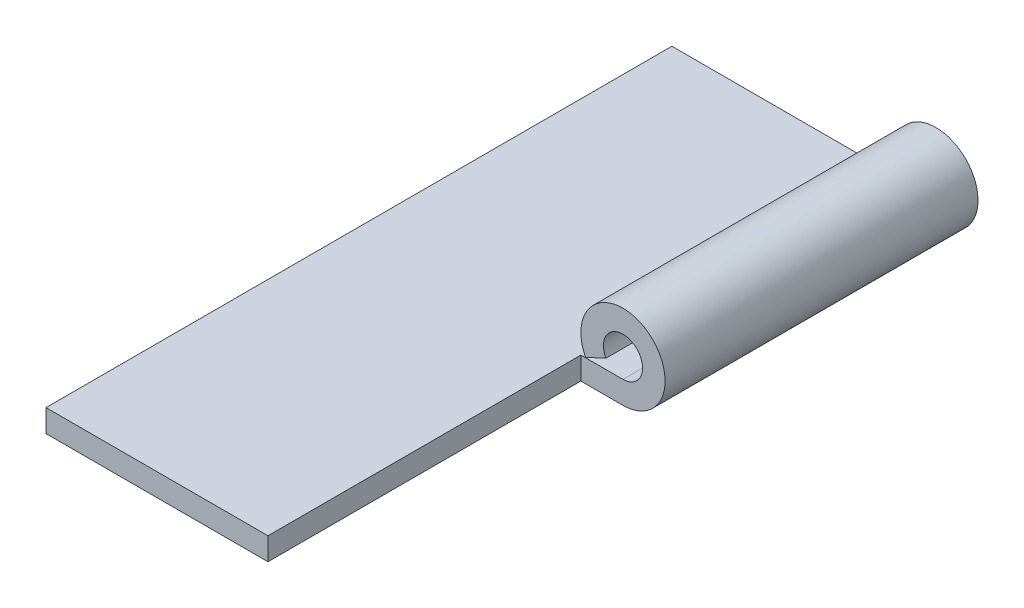
ISO-10303-21;
HEADER;
FILE_DESCRIPTION(('STEP AP214'),'2;1');
FILE_NAME('part.step','',(''),(''),'','','');
FILE_SCHEMA(('AUTOMOTIVE_DESIGN { 1 0 10303 214 1 1 1 1 }'));
ENDSEC;
DATA;
#1=APPLICATION_CONTEXT('core data for automotive mechanical design processes');
#2=APPLICATION_PROTOCOL_DEFINITION('international standard','automotive_design',2000,#1);
#3=PRODUCT_CONTEXT('',#1,'mechanical');
#4=PRODUCT('Part','Part','',(#3));
#5=PRODUCT_RELATED_PRODUCT_CATEGORY('part','',(#4));
#6=PRODUCT_DEFINITION_FORMATION('','',#4);
#7=PRODUCT_DEFINITION_CONTEXT('part definition',#1,'design');
#8=PRODUCT_DEFINITION('design','',#6,#7);
#9=PRODUCT_DEFINITION_SHAPE('','',#8);
#10=(LENGTH_UNIT() NAMED_UNIT(*) SI_UNIT(.MILLI.,.METRE.));
#11=(NAMED_UNIT(*) PLANE_ANGLE_UNIT() SI_UNIT($,.RADIAN.));
#12=(NAMED_UNIT(*) SI_UNIT($,.STERADIAN.) SOLID_ANGLE_UNIT());
#13=UNCERTAINTY_MEASURE_WITH_UNIT(LENGTH_MEASURE(1.E-05),#10,'distance_accuracy_value','');
#14=(GEOMETRIC_REPRESENTATION_CONTEXT(3) GLOBAL_UNCERTAINTY_ASSIGNED_CONTEXT((#13)) GLOBAL_UNIT_ASSIGNED_CONTEXT((#10,
#11,#12)) REPRESENTATION_CONTEXT('',''));
#15=CARTESIAN_POINT('',(0.,0.,0.));
#16=DIRECTION('',(0.,0.,1.));
#17=DIRECTION('',(1.,0.,0.));
#18=AXIS2_PLACEMENT_3D('',#15,#16,#17);
#19=CARTESIAN_POINT('',(-21.43125,1.8288,-50.8));
#20=DIRECTION('',(0.,1.,0.));
#21=DIRECTION('',(0.,0.,1.));
#22=AXIS2_PLACEMENT_3D('',#19,#20,#21);
#23=PLANE('',#22);
#24=DIRECTION('',(0.,0.,-1.));
#25=VECTOR('',#24,1.);
#26=CARTESIAN_POINT('',(-3.4163,1.8288,-50.8));
#27=LINE('',#26,#25);
#28=CARTESIAN_POINT('',(-3.4163,1.8288,0.));
#29=VERTEX_POINT('',#28);
#30=CARTESIAN_POINT('',(-3.4163,1.8288,-25.4));
#31=VERTEX_POINT('',#30);
#32=EDGE_CURVE('E54',#29,#31,#27,.T.);
#33=ORIENTED_EDGE('',*,*,#32,.T.);
#34=DIRECTION('',(1.,0.,0.));
#35=VECTOR('',#34,1.);
#36=CARTESIAN_POINT('',(-21.43125,1.8288,-25.4));
#37=LINE('',#36,#35);
#38=CARTESIAN_POINT('',(0.,1.8288,-25.4));
#39=VERTEX_POINT('',#38);
#40=EDGE_CURVE('E134',#31,#39,#37,.T.);
#41=ORIENTED_EDGE('',*,*,#40,.T.);
#42=DIRECTION('',(0.,0.,1.));
#43=VECTOR('',#42,1.);
#44=CARTESIAN_POINT('',(0.,1.8288,-50.8));
#45=LINE('',#44,#43);
#46=CARTESIAN_POINT('',(0.,1.8288,-50.8));
#47=VERTEX_POINT('',#46);
#48=EDGE_CURVE('E110',#47,#39,#45,.T.);
#49=ORIENTED_EDGE('',*,*,#48,.F.);
#50=DIRECTION('',(-1.,0.,0.));
#51=VECTOR('',#50,1.);
#52=CARTESIAN_POINT('',(-21.43125,1.8288,-50.8));
#53=LINE('',#52,#51);
#54=CARTESIAN_POINT('',(-21.43125,1.8288,-50.8));
#55=VERTEX_POINT('',#54);
#56=EDGE_CURVE('E120',#47,#55,#53,.T.);
#57=ORIENTED_EDGE('',*,*,#56,.T.);
#58=DIRECTION('',(0.,0.,1.));
#59=VECTOR('',#58,1.);
#60=CARTESIAN_POINT('',(-21.43125,1.8288,-50.8));
#61=LINE('',#60,#59);
#62=CARTESIAN_POINT('',(-21.43125,1.8288,0.));
#63=VERTEX_POINT('',#62);
#64=EDGE_CURVE('E47',#55,#63,#61,.T.);
#65=ORIENTED_EDGE('',*,*,#64,.T.);
#66=DIRECTION('',(-1.,0.,0.));
#67=VECTOR('',#66,1.);
#68=CARTESIAN_POINT('',(-21.43125,1.8288,0.));
#69=LINE('',#68,#67);
#70=EDGE_CURVE('E77',#29,#63,#69,.T.);
#71=ORIENTED_EDGE('',*,*,#70,.F.);
#72=EDGE_LOOP('',(#33,#41,#49,#57,#65,#71));
#73=FACE_BOUND('',#72,.T.);
#74=ADVANCED_FACE('F39',(#73),#23,.T.);
#75=CARTESIAN_POINT('',(0.,3.4163,-50.8));
#76=DIRECTION('',(0.,0.,1.));
#77=DIRECTION('',(1.,0.,0.));
#78=AXIS2_PLACEMENT_3D('',#75,#76,#77);
#79=CYLINDRICAL_SURFACE('',#78,1.5875);
#80=ORIENTED_EDGE('',*,*,#48,.T.);
#81=CARTESIAN_POINT('',(0.,3.4163,-25.4));
#82=DIRECTION('',(0.,0.,1.));
#83=DIRECTION('',(1.,0.,0.));
#84=AXIS2_PLACEMENT_3D('',#81,#82,#83);
#85=CIRCLE('',#84,1.5875);
#86=CARTESIAN_POINT('',(-1.37813295508886,2.62832423381296,-25.4));
#87=VERTEX_POINT('',#86);
#88=EDGE_CURVE('E106',#39,#87,#85,.T.);
#89=ORIENTED_EDGE('',*,*,#88,.T.);
#90=DIRECTION('',(0.,0.,1.));
#91=VECTOR('',#90,1.);
#92=CARTESIAN_POINT('',(-1.37813295508886,2.62832423381296,-50.8));
#93=LINE('',#92,#91);
#94=CARTESIAN_POINT('',(-1.37813295508886,2.62832423381296,-50.8));
#95=VERTEX_POINT('',#94);
#96=EDGE_CURVE('E98',#95,#87,#93,.T.);
#97=ORIENTED_EDGE('',*,*,#96,.F.);
#98=CARTESIAN_POINT('',(0.,3.4163,-50.8));
#99=DIRECTION('',(0.,0.,-1.));
#100=DIRECTION('',(1.,0.,0.));
#101=AXIS2_PLACEMENT_3D('',#98,#99,#100);
#102=CIRCLE('',#101,1.5875);
#103=EDGE_CURVE('E102',#95,#47,#102,.T.);
#104=ORIENTED_EDGE('',*,*,#103,.T.);
#105=EDGE_LOOP('',(#80,#89,#97,#104));
#106=FACE_BOUND('',#105,.T.);
#107=ADVANCED_FACE('F101',(#106),#79,.F.);
#108=CARTESIAN_POINT('',(-3.03824773183491,1.8542,-50.8));
#109=DIRECTION('',(0.422618261740701,-0.906307787036649,0.));
#110=DIRECTION('',(0.906307787036649,0.422618261740701,0.));
#111=AXIS2_PLACEMENT_3D('',#108,#109,#110);
#112=PLANE('',#111);
#113=ORIENTED_EDGE('',*,*,#96,.T.);
#114=DIRECTION('',(-0.906307787036649,-0.422618261740701,0.));
#115=VECTOR('',#114,1.);
#116=CARTESIAN_POINT('',(-3.03824773183491,1.8542,-25.4));
#117=LINE('',#116,#115);
#118=CARTESIAN_POINT('',(-3.03824773183492,1.8542,-25.4));
#119=VERTEX_POINT('',#118);
#120=EDGE_CURVE('E201',#87,#119,#117,.T.);
#121=ORIENTED_EDGE('',*,*,#120,.T.);
#122=DIRECTION('',(0.,0.,1.));
#123=VECTOR('',#122,1.);
#124=CARTESIAN_POINT('',(-3.03824773183492,1.8542,-50.8));
#125=LINE('',#124,#123);
#126=CARTESIAN_POINT('',(-3.03824773183492,1.8542,-50.8));
#127=VERTEX_POINT('',#126);
#128=EDGE_CURVE('E111',#127,#119,#125,.T.);
#129=ORIENTED_EDGE('',*,*,#128,.F.);
#130=DIRECTION('',(0.906307787036649,0.422618261740701,0.));
#131=VECTOR('',#130,1.);
#132=CARTESIAN_POINT('',(-3.03824773183491,1.8542,-50.8));
#133=LINE('',#132,#131);
#134=EDGE_CURVE('E117',#127,#95,#133,.T.);
#135=ORIENTED_EDGE('',*,*,#134,.T.);
#136=EDGE_LOOP('',(#113,#121,#129,#135));
#137=FACE_BOUND('',#136,.T.);
#138=ADVANCED_FACE('F122',(#137),#112,.T.);
#139=CARTESIAN_POINT('',(0.,3.4163,-50.8));
#140=DIRECTION('',(0.,0.,1.));
#141=DIRECTION('',(1.,0.,0.));
#142=AXIS2_PLACEMENT_3D('',#139,#140,#141);
#143=CYLINDRICAL_SURFACE('',#142,3.4163);
#144=ORIENTED_EDGE('',*,*,#128,.T.);
#145=CARTESIAN_POINT('',(0.,3.4163,-25.4));
#146=DIRECTION('',(0.,0.,1.));
#147=DIRECTION('',(1.,0.,0.));
#148=AXIS2_PLACEMENT_3D('',#145,#146,#147);
#149=CIRCLE('',#148,3.4163);
#150=CARTESIAN_POINT('',(0.,0.,-25.4));
#151=VERTEX_POINT('',#150);
#152=EDGE_CURVE('E177',#119,#151,#149,.F.);
#153=ORIENTED_EDGE('',*,*,#152,.T.);
#154=DIRECTION('',(0.,0.,1.));
#155=VECTOR('',#154,1.);
#156=CARTESIAN_POINT('',(0.,0.,-50.8));
#157=LINE('',#156,#155);
#158=CARTESIAN_POINT('',(0.,0.,-50.8));
#159=VERTEX_POINT('',#158);
#160=EDGE_CURVE('E142',#159,#151,#157,.T.);
#161=ORIENTED_EDGE('',*,*,#160,.F.);
#162=CARTESIAN_POINT('',(0.,3.4163,-50.8));
#163=DIRECTION('',(0.,0.,1.));
#164=DIRECTION('',(1.,0.,0.));
#165=AXIS2_PLACEMENT_3D('',#162,#163,#164);
#166=CIRCLE('',#165,3.4163);
#167=EDGE_CURVE('E124',#159,#127,#166,.T.);
#168=ORIENTED_EDGE('',*,*,#167,.T.);
#169=EDGE_LOOP('',(#144,#153,#161,#168));
#170=FACE_BOUND('',#169,.T.);
#171=ADVANCED_FACE('F157',(#170),#143,.T.);
#172=CARTESIAN_POINT('',(-21.43125,0.,-50.8));
#173=DIRECTION('',(0.,-1.,0.));
#174=DIRECTION('',(0.,0.,-1.));
#175=AXIS2_PLACEMENT_3D('',#172,#173,#174);
#176=PLANE('',#175);
#177=ORIENTED_EDGE('',*,*,#160,.T.);
#178=DIRECTION('',(-1.,0.,0.));
#179=VECTOR('',#178,1.);
#180=CARTESIAN_POINT('',(3.4163,0.,-25.4));
#181=LINE('',#180,#179);
#182=CARTESIAN_POINT('',(-3.4163,0.,-25.4));
#183=VERTEX_POINT('',#182);
#184=EDGE_CURVE('E192',#151,#183,#181,.T.);
#185=ORIENTED_EDGE('',*,*,#184,.T.);
#186=DIRECTION('',(0.,0.,1.));
#187=VECTOR('',#186,1.);
#188=CARTESIAN_POINT('',(-3.4163,0.,0.));
#189=LINE('',#188,#187);
#190=CARTESIAN_POINT('',(-3.4163,0.,0.));
#191=VERTEX_POINT('',#190);
#192=EDGE_CURVE('E149',#183,#191,#189,.T.);
#193=ORIENTED_EDGE('',*,*,#192,.T.);
#194=DIRECTION('',(1.,0.,0.));
#195=VECTOR('',#194,1.);
#196=CARTESIAN_POINT('',(-21.43125,0.,0.));
#197=LINE('',#196,#195);
#198=CARTESIAN_POINT('',(-21.43125,0.,0.));
#199=VERTEX_POINT('',#198);
#200=EDGE_CURVE('E133',#199,#191,#197,.T.);
#201=ORIENTED_EDGE('',*,*,#200,.F.);
#202=DIRECTION('',(0.,0.,1.));
#203=VECTOR('',#202,1.);
#204=CARTESIAN_POINT('',(-21.43125,0.,-50.8));
#205=LINE('',#204,#203);
#206=CARTESIAN_POINT('',(-21.43125,0.,-50.8));
#207=VERTEX_POINT('',#206);
#208=EDGE_CURVE('E84',#207,#199,#205,.T.);
#209=ORIENTED_EDGE('',*,*,#208,.F.);
#210=DIRECTION('',(1.,0.,0.));
#211=VECTOR('',#210,1.);
#212=CARTESIAN_POINT('',(-21.43125,0.,-50.8));
#213=LINE('',#212,#211);
#214=EDGE_CURVE('E126',#207,#159,#213,.T.);
#215=ORIENTED_EDGE('',*,*,#214,.T.);
#216=EDGE_LOOP('',(#177,#185,#193,#201,#209,#215));
#217=FACE_BOUND('',#216,.T.);
#218=ADVANCED_FACE('F145',(#217),#176,.T.);
#219=CARTESIAN_POINT('',(0.,3.4163,0.));
#220=DIRECTION('',(0.,0.,1.));
#221=DIRECTION('',(1.,0.,0.));
#222=AXIS2_PLACEMENT_3D('',#219,#220,#221);
#223=PLANE('',#222);
#224=ORIENTED_EDGE('',*,*,#200,.T.);
#225=DIRECTION('',(0.,1.,0.));
#226=VECTOR('',#225,1.);
#227=CARTESIAN_POINT('',(-3.4163,3.4163,0.));
#228=LINE('',#227,#226);
#229=EDGE_CURVE('E11',#191,#29,#228,.T.);
#230=ORIENTED_EDGE('',*,*,#229,.T.);
#231=ORIENTED_EDGE('',*,*,#70,.T.);
#232=DIRECTION('',(0.,-1.,0.));
#233=VECTOR('',#232,1.);
#234=CARTESIAN_POINT('',(-21.43125,0.,0.));
#235=LINE('',#234,#233);
#236=EDGE_CURVE('E131',#63,#199,#235,.T.);
#237=ORIENTED_EDGE('',*,*,#236,.T.);
#238=EDGE_LOOP('',(#224,#230,#231,#237));
#239=FACE_BOUND('',#238,.T.);
#240=ADVANCED_FACE('F150',(#239),#223,.T.);
#241=CARTESIAN_POINT('',(-21.43125,0.,-50.8));
#242=DIRECTION('',(-1.,0.,0.));
#243=DIRECTION('',(0.,0.,1.));
#244=AXIS2_PLACEMENT_3D('',#241,#242,#243);
#245=PLANE('',#244);
#246=ORIENTED_EDGE('',*,*,#236,.F.);
#247=ORIENTED_EDGE('',*,*,#64,.F.);
#248=DIRECTION('',(0.,-1.,0.));
#249=VECTOR('',#248,1.);
#250=CARTESIAN_POINT('',(-21.43125,0.,-50.8));
#251=LINE('',#250,#249);
#252=EDGE_CURVE('E138',#55,#207,#251,.T.);
#253=ORIENTED_EDGE('',*,*,#252,.T.);
#254=ORIENTED_EDGE('',*,*,#208,.T.);
#255=EDGE_LOOP('',(#246,#247,#253,#254));
#256=FACE_BOUND('',#255,.T.);
#257=ADVANCED_FACE('F41',(#256),#245,.T.);
#258=CARTESIAN_POINT('',(0.,3.4163,-50.8));
#259=DIRECTION('',(0.,0.,1.));
#260=DIRECTION('',(1.,0.,0.));
#261=AXIS2_PLACEMENT_3D('',#258,#259,#260);
#262=PLANE('',#261);
#263=ORIENTED_EDGE('',*,*,#252,.F.);
#264=ORIENTED_EDGE('',*,*,#56,.F.);
#265=ORIENTED_EDGE('',*,*,#103,.F.);
#266=ORIENTED_EDGE('',*,*,#134,.F.);
#267=ORIENTED_EDGE('',*,*,#167,.F.);
#268=ORIENTED_EDGE('',*,*,#214,.F.);
#269=EDGE_LOOP('',(#263,#264,#265,#266,#267,#268));
#270=FACE_BOUND('',#269,.T.);
#271=ADVANCED_FACE('F115',(#270),#262,.F.);
#272=CARTESIAN_POINT('',(3.4163,6.8326,-25.4));
#273=DIRECTION('',(0.,0.,1.));
#274=DIRECTION('',(1.,0.,0.));
#275=AXIS2_PLACEMENT_3D('',#272,#273,#274);
#276=PLANE('',#275);
#277=DIRECTION('',(0.,-1.,0.));
#278=VECTOR('',#277,1.);
#279=CARTESIAN_POINT('',(-3.4163,6.8326,-25.4));
#280=LINE('',#279,#278);
#281=EDGE_CURVE('E190',#31,#183,#280,.T.);
#282=ORIENTED_EDGE('',*,*,#281,.T.);
#283=ORIENTED_EDGE('',*,*,#184,.F.);
#284=ORIENTED_EDGE('',*,*,#152,.F.);
#285=ORIENTED_EDGE('',*,*,#120,.F.);
#286=ORIENTED_EDGE('',*,*,#88,.F.);
#287=ORIENTED_EDGE('',*,*,#40,.F.);
#288=EDGE_LOOP('',(#282,#283,#284,#285,#286,#287));
#289=FACE_BOUND('',#288,.T.);
#290=ADVANCED_FACE('F191',(#289),#276,.T.);
#291=CARTESIAN_POINT('',(-3.4163,6.8326,0.));
#292=DIRECTION('',(1.,0.,0.));
#293=DIRECTION('',(0.,0.,-1.));
#294=AXIS2_PLACEMENT_3D('',#291,#292,#293);
#295=PLANE('',#294);
#296=ORIENTED_EDGE('',*,*,#229,.F.);
#297=ORIENTED_EDGE('',*,*,#192,.F.);
#298=ORIENTED_EDGE('',*,*,#281,.F.);
#299=ORIENTED_EDGE('',*,*,#32,.F.);
#300=EDGE_LOOP('',(#296,#297,#298,#299));
#301=FACE_BOUND('',#300,.T.);
#302=ADVANCED_FACE('F195',(#301),#295,.T.);
#303=CLOSED_SHELL('',(#74,#107,#138,#171,#218,#240,#257,#271,#290,#302));
#304=MANIFOLD_SOLID_BREP('B2',#303);
#305=ADVANCED_BREP_SHAPE_REPRESENTATION('',(#18,#304),#14);
#306=SHAPE_DEFINITION_REPRESENTATION(#9,#305);
ENDSEC;
END-ISO-10303-21;
